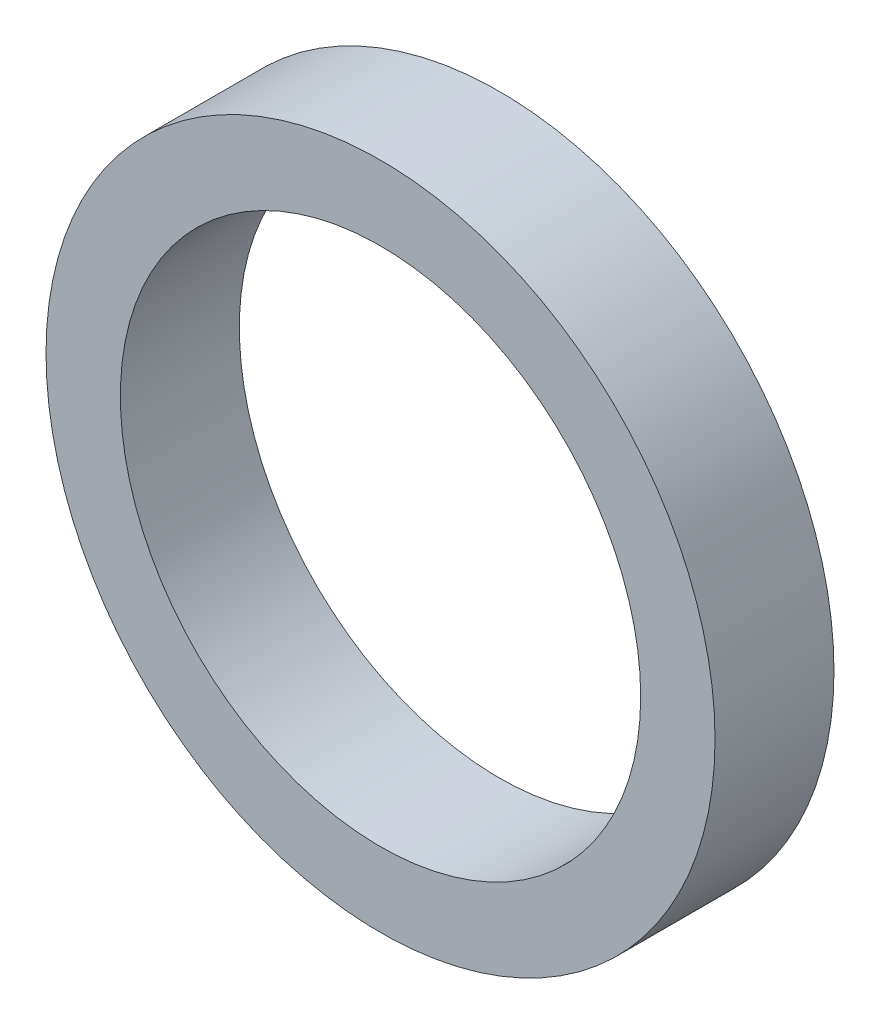
ISO-10303-21;
HEADER;
FILE_DESCRIPTION(('STEP AP214'),'2;1');
FILE_NAME('part.step','',(''),(''),'','','');
FILE_SCHEMA(('AUTOMOTIVE_DESIGN { 1 0 10303 214 1 1 1 1 }'));
ENDSEC;
DATA;
#1=APPLICATION_CONTEXT('core data for automotive mechanical design processes');
#2=APPLICATION_PROTOCOL_DEFINITION('international standard','automotive_design',2000,#1);
#3=PRODUCT_CONTEXT('',#1,'mechanical');
#4=PRODUCT('Part','Part','',(#3));
#5=PRODUCT_RELATED_PRODUCT_CATEGORY('part','',(#4));
#6=PRODUCT_DEFINITION_FORMATION('','',#4);
#7=PRODUCT_DEFINITION_CONTEXT('part definition',#1,'design');
#8=PRODUCT_DEFINITION('design','',#6,#7);
#9=PRODUCT_DEFINITION_SHAPE('','',#8);
#10=(LENGTH_UNIT() NAMED_UNIT(*) SI_UNIT(.MILLI.,.METRE.));
#11=(NAMED_UNIT(*) PLANE_ANGLE_UNIT() SI_UNIT($,.RADIAN.));
#12=(NAMED_UNIT(*) SI_UNIT($,.STERADIAN.) SOLID_ANGLE_UNIT());
#13=UNCERTAINTY_MEASURE_WITH_UNIT(LENGTH_MEASURE(1.E-05),#10,'distance_accuracy_value','');
#14=(GEOMETRIC_REPRESENTATION_CONTEXT(3) GLOBAL_UNCERTAINTY_ASSIGNED_CONTEXT((#13)) GLOBAL_UNIT_ASSIGNED_CONTEXT((#10,
#11,#12)) REPRESENTATION_CONTEXT('',''));
#15=CARTESIAN_POINT('',(0.,0.,0.));
#16=DIRECTION('',(0.,0.,1.));
#17=DIRECTION('',(1.,0.,0.));
#18=AXIS2_PLACEMENT_3D('',#15,#16,#17);
#19=CARTESIAN_POINT('',(0.,0.,1.27));
#20=DIRECTION('',(0.,0.,1.));
#21=DIRECTION('',(1.,0.,0.));
#22=AXIS2_PLACEMENT_3D('',#19,#20,#21);
#23=PLANE('',#22);
#24=CARTESIAN_POINT('',(0.,0.,1.27));
#25=DIRECTION('',(0.,0.,1.));
#26=DIRECTION('',(1.,0.,0.));
#27=AXIS2_PLACEMENT_3D('',#24,#25,#26);
#28=CIRCLE('',#27,7.14375);
#29=CARTESIAN_POINT('',(7.14375,0.,1.27));
#30=VERTEX_POINT('',#29);
#31=EDGE_CURVE('E10',#30,#30,#28,.T.);
#32=ORIENTED_EDGE('',*,*,#31,.T.);
#33=EDGE_LOOP('',(#32));
#34=FACE_BOUND('',#33,.T.);
#35=CARTESIAN_POINT('',(0.,0.,1.27));
#36=DIRECTION('',(0.,0.,1.));
#37=DIRECTION('',(1.,0.,0.));
#38=AXIS2_PLACEMENT_3D('',#35,#36,#37);
#39=CIRCLE('',#38,5.55625);
#40=CARTESIAN_POINT('',(5.55625,0.,1.27));
#41=VERTEX_POINT('',#40);
#42=EDGE_CURVE('E51',#41,#41,#39,.T.);
#43=ORIENTED_EDGE('',*,*,#42,.F.);
#44=EDGE_LOOP('',(#43));
#45=FACE_BOUND('',#44,.T.);
#46=ADVANCED_FACE('F36',(#34,#45),#23,.T.);
#47=CARTESIAN_POINT('',(0.,0.,-1.27));
#48=DIRECTION('',(0.,0.,1.));
#49=DIRECTION('',(1.,0.,0.));
#50=AXIS2_PLACEMENT_3D('',#47,#48,#49);
#51=PLANE('',#50);
#52=CARTESIAN_POINT('',(0.,0.,-1.27));
#53=DIRECTION('',(0.,0.,1.));
#54=DIRECTION('',(1.,0.,0.));
#55=AXIS2_PLACEMENT_3D('',#52,#53,#54);
#56=CIRCLE('',#55,7.14375);
#57=CARTESIAN_POINT('',(7.14375,0.,-1.27));
#58=VERTEX_POINT('',#57);
#59=EDGE_CURVE('E40',#58,#58,#56,.T.);
#60=ORIENTED_EDGE('',*,*,#59,.F.);
#61=EDGE_LOOP('',(#60));
#62=FACE_BOUND('',#61,.T.);
#63=CARTESIAN_POINT('',(0.,0.,-1.27));
#64=DIRECTION('',(0.,0.,1.));
#65=DIRECTION('',(1.,0.,0.));
#66=AXIS2_PLACEMENT_3D('',#63,#64,#65);
#67=CIRCLE('',#66,5.55625);
#68=CARTESIAN_POINT('',(5.55625,0.,-1.27));
#69=VERTEX_POINT('',#68);
#70=EDGE_CURVE('E53',#69,#69,#67,.T.);
#71=ORIENTED_EDGE('',*,*,#70,.T.);
#72=EDGE_LOOP('',(#71));
#73=FACE_BOUND('',#72,.T.);
#74=ADVANCED_FACE('F63',(#62,#73),#51,.F.);
#75=CARTESIAN_POINT('',(0.,0.,1.27));
#76=DIRECTION('',(0.,0.,-1.));
#77=DIRECTION('',(-1.,0.,0.));
#78=AXIS2_PLACEMENT_3D('',#75,#76,#77);
#79=CYLINDRICAL_SURFACE('',#78,7.14375);
#80=ORIENTED_EDGE('',*,*,#31,.F.);
#81=EDGE_LOOP('',(#80));
#82=FACE_BOUND('',#81,.T.);
#83=ORIENTED_EDGE('',*,*,#59,.T.);
#84=EDGE_LOOP('',(#83));
#85=FACE_BOUND('',#84,.T.);
#86=ADVANCED_FACE('F38',(#82,#85),#79,.T.);
#87=CARTESIAN_POINT('',(0.,0.,1.27));
#88=DIRECTION('',(0.,0.,-1.));
#89=DIRECTION('',(-1.,0.,0.));
#90=AXIS2_PLACEMENT_3D('',#87,#88,#89);
#91=CYLINDRICAL_SURFACE('',#90,5.55625);
#92=ORIENTED_EDGE('',*,*,#42,.T.);
#93=EDGE_LOOP('',(#92));
#94=FACE_BOUND('',#93,.T.);
#95=ORIENTED_EDGE('',*,*,#70,.F.);
#96=EDGE_LOOP('',(#95));
#97=FACE_BOUND('',#96,.T.);
#98=ADVANCED_FACE('F59',(#94,#97),#91,.F.);
#99=CLOSED_SHELL('',(#46,#74,#86,#98));
#100=MANIFOLD_SOLID_BREP('B2',#99);
#101=ADVANCED_BREP_SHAPE_REPRESENTATION('',(#18,#100),#14);
#102=SHAPE_DEFINITION_REPRESENTATION(#9,#101);
ENDSEC;
END-ISO-10303-21;
